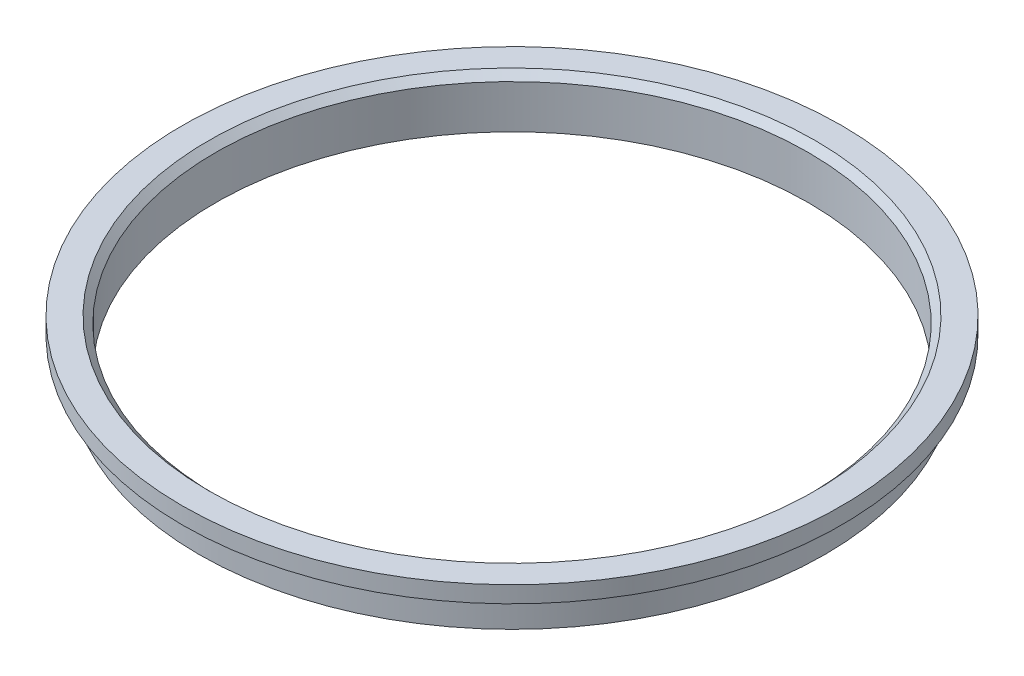
ISO-10303-21;
HEADER;
FILE_DESCRIPTION(('STEP AP214'),'2;1');
FILE_NAME('part.step','',(''),(''),'','','');
FILE_SCHEMA(('AUTOMOTIVE_DESIGN { 1 0 10303 214 1 1 1 1 }'));
ENDSEC;
DATA;
#1=APPLICATION_CONTEXT('core data for automotive mechanical design processes');
#2=APPLICATION_PROTOCOL_DEFINITION('international standard','automotive_design',2000,#1);
#3=PRODUCT_CONTEXT('',#1,'mechanical');
#4=PRODUCT('Part','Part','',(#3));
#5=PRODUCT_RELATED_PRODUCT_CATEGORY('part','',(#4));
#6=PRODUCT_DEFINITION_FORMATION('','',#4);
#7=PRODUCT_DEFINITION_CONTEXT('part definition',#1,'design');
#8=PRODUCT_DEFINITION('design','',#6,#7);
#9=PRODUCT_DEFINITION_SHAPE('','',#8);
#10=(LENGTH_UNIT() NAMED_UNIT(*) SI_UNIT(.MILLI.,.METRE.));
#11=(NAMED_UNIT(*) PLANE_ANGLE_UNIT() SI_UNIT($,.RADIAN.));
#12=(NAMED_UNIT(*) SI_UNIT($,.STERADIAN.) SOLID_ANGLE_UNIT());
#13=UNCERTAINTY_MEASURE_WITH_UNIT(LENGTH_MEASURE(1.E-05),#10,'distance_accuracy_value','');
#14=(GEOMETRIC_REPRESENTATION_CONTEXT(3) GLOBAL_UNCERTAINTY_ASSIGNED_CONTEXT((#13)) GLOBAL_UNIT_ASSIGNED_CONTEXT((#10,
#11,#12)) REPRESENTATION_CONTEXT('',''));
#15=CARTESIAN_POINT('',(0.,0.,0.));
#16=DIRECTION('',(0.,0.,1.));
#17=DIRECTION('',(1.,0.,0.));
#18=AXIS2_PLACEMENT_3D('',#15,#16,#17);
#19=CARTESIAN_POINT('',(-54.5465,-9.271,0.));
#20=DIRECTION('',(0.,1.,0.));
#21=DIRECTION('',(0.,0.,1.));
#22=AXIS2_PLACEMENT_3D('',#19,#20,#21);
#23=PLANE('',#22);
#24=CARTESIAN_POINT('',(0.,-9.271,0.));
#25=DIRECTION('',(0.,-1.,0.));
#26=DIRECTION('',(0.,0.,-1.));
#27=AXIS2_PLACEMENT_3D('',#24,#25,#26);
#28=CIRCLE('',#27,54.5465);
#29=CARTESIAN_POINT('',(0.,-9.271,-54.5465));
#30=VERTEX_POINT('',#29);
#31=EDGE_CURVE('E70',#30,#30,#28,.T.);
#32=ORIENTED_EDGE('',*,*,#31,.F.);
#33=EDGE_LOOP('',(#32));
#34=FACE_BOUND('',#33,.T.);
#35=CARTESIAN_POINT('',(0.,-9.271,0.));
#36=DIRECTION('',(0.,-1.,0.));
#37=DIRECTION('',(0.,0.,-1.));
#38=AXIS2_PLACEMENT_3D('',#35,#36,#37);
#39=CIRCLE('',#38,57.5945);
#40=CARTESIAN_POINT('',(0.,-9.271,-57.5945));
#41=VERTEX_POINT('',#40);
#42=EDGE_CURVE('E60',#41,#41,#39,.T.);
#43=ORIENTED_EDGE('',*,*,#42,.T.);
#44=EDGE_LOOP('',(#43));
#45=FACE_BOUND('',#44,.T.);
#46=ADVANCED_FACE('F34',(#34,#45),#23,.F.);
#47=CARTESIAN_POINT('',(0.,0.,0.));
#48=DIRECTION('',(0.,-1.,0.));
#49=DIRECTION('',(0.,0.,-1.));
#50=AXIS2_PLACEMENT_3D('',#47,#48,#49);
#51=CYLINDRICAL_SURFACE('',#50,57.5945);
#52=CARTESIAN_POINT('',(0.,-4.63550000000001,0.));
#53=DIRECTION('',(0.,1.,0.));
#54=DIRECTION('',(0.,0.,1.));
#55=AXIS2_PLACEMENT_3D('',#52,#53,#54);
#56=CIRCLE('',#55,57.5945);
#57=CARTESIAN_POINT('',(0.,-4.63550000000001,57.5945));
#58=VERTEX_POINT('',#57);
#59=EDGE_CURVE('E42',#58,#58,#56,.F.);
#60=ORIENTED_EDGE('',*,*,#59,.T.);
#61=EDGE_LOOP('',(#60));
#62=FACE_BOUND('',#61,.T.);
#63=ORIENTED_EDGE('',*,*,#42,.F.);
#64=EDGE_LOOP('',(#63));
#65=FACE_BOUND('',#64,.T.);
#66=ADVANCED_FACE('F78',(#62,#65),#51,.T.);
#67=CARTESIAN_POINT('',(-57.5945,-3.04800000000001,0.));
#68=DIRECTION('',(0.,1.,0.));
#69=DIRECTION('',(0.,0.,1.));
#70=AXIS2_PLACEMENT_3D('',#67,#68,#69);
#71=PLANE('',#70);
#72=CARTESIAN_POINT('',(0.,-3.04800000000001,0.));
#73=DIRECTION('',(0.,1.,0.));
#74=DIRECTION('',(0.,0.,1.));
#75=AXIS2_PLACEMENT_3D('',#72,#73,#74);
#76=CIRCLE('',#75,59.182);
#77=CARTESIAN_POINT('',(0.,-3.04800000000001,59.182));
#78=VERTEX_POINT('',#77);
#79=EDGE_CURVE('E10',#78,#78,#76,.T.);
#80=ORIENTED_EDGE('',*,*,#79,.T.);
#81=EDGE_LOOP('',(#80));
#82=FACE_BOUND('',#81,.T.);
#83=CARTESIAN_POINT('',(0.,-3.04800000000001,0.));
#84=DIRECTION('',(0.,-1.,0.));
#85=DIRECTION('',(0.,0.,-1.));
#86=AXIS2_PLACEMENT_3D('',#83,#84,#85);
#87=CIRCLE('',#86,60.6425);
#88=CARTESIAN_POINT('',(0.,-3.04800000000001,-60.6425));
#89=VERTEX_POINT('',#88);
#90=EDGE_CURVE('E64',#89,#89,#87,.T.);
#91=ORIENTED_EDGE('',*,*,#90,.T.);
#92=EDGE_LOOP('',(#91));
#93=FACE_BOUND('',#92,.T.);
#94=ADVANCED_FACE('F83',(#82,#93),#71,.F.);
#95=CARTESIAN_POINT('',(0.,0.,0.));
#96=DIRECTION('',(0.,-1.,0.));
#97=DIRECTION('',(0.,0.,-1.));
#98=AXIS2_PLACEMENT_3D('',#95,#96,#97);
#99=CYLINDRICAL_SURFACE('',#98,60.6425);
#100=ORIENTED_EDGE('',*,*,#90,.F.);
#101=EDGE_LOOP('',(#100));
#102=FACE_BOUND('',#101,.T.);
#103=CARTESIAN_POINT('',(0.,0.,0.));
#104=DIRECTION('',(0.,-1.,0.));
#105=DIRECTION('',(0.,0.,-1.));
#106=AXIS2_PLACEMENT_3D('',#103,#104,#105);
#107=CIRCLE('',#106,60.6425);
#108=CARTESIAN_POINT('',(0.,0.,-60.6425));
#109=VERTEX_POINT('',#108);
#110=EDGE_CURVE('E67',#109,#109,#107,.T.);
#111=ORIENTED_EDGE('',*,*,#110,.T.);
#112=EDGE_LOOP('',(#111));
#113=FACE_BOUND('',#112,.T.);
#114=ADVANCED_FACE('F88',(#102,#113),#99,.T.);
#115=CARTESIAN_POINT('',(-60.6425,0.,0.));
#116=DIRECTION('',(0.,-1.,0.));
#117=DIRECTION('',(0.,0.,-1.));
#118=AXIS2_PLACEMENT_3D('',#115,#116,#117);
#119=PLANE('',#118);
#120=CARTESIAN_POINT('',(0.,0.,0.));
#121=DIRECTION('',(0.,-1.,0.));
#122=DIRECTION('',(0.,0.,-1.));
#123=AXIS2_PLACEMENT_3D('',#120,#121,#122);
#124=CIRCLE('',#123,55.8165);
#125=CARTESIAN_POINT('',(0.,0.,-55.8165));
#126=VERTEX_POINT('',#125);
#127=EDGE_CURVE('E55',#126,#126,#124,.T.);
#128=ORIENTED_EDGE('',*,*,#127,.T.);
#129=EDGE_LOOP('',(#128));
#130=FACE_BOUND('',#129,.T.);
#131=ORIENTED_EDGE('',*,*,#110,.F.);
#132=EDGE_LOOP('',(#131));
#133=FACE_BOUND('',#132,.T.);
#134=ADVANCED_FACE('F99',(#130,#133),#119,.F.);
#135=CARTESIAN_POINT('',(0.,0.,0.));
#136=DIRECTION('',(0.,-1.,0.));
#137=DIRECTION('',(0.,0.,-1.));
#138=AXIS2_PLACEMENT_3D('',#135,#136,#137);
#139=CYLINDRICAL_SURFACE('',#138,54.5465);
#140=CARTESIAN_POINT('',(0.,-1.26999999999999,0.));
#141=DIRECTION('',(0.,-1.,0.));
#142=DIRECTION('',(0.,0.,-1.));
#143=AXIS2_PLACEMENT_3D('',#140,#141,#142);
#144=CIRCLE('',#143,54.5465);
#145=CARTESIAN_POINT('',(0.,-1.26999999999999,-54.5465));
#146=VERTEX_POINT('',#145);
#147=EDGE_CURVE('E49',#146,#146,#144,.F.);
#148=ORIENTED_EDGE('',*,*,#147,.T.);
#149=EDGE_LOOP('',(#148));
#150=FACE_BOUND('',#149,.T.);
#151=ORIENTED_EDGE('',*,*,#31,.T.);
#152=EDGE_LOOP('',(#151));
#153=FACE_BOUND('',#152,.T.);
#154=ADVANCED_FACE('F74',(#150,#153),#139,.F.);
#155=CARTESIAN_POINT('',(0.,0.,0.));
#156=DIRECTION('',(0.,1.,0.));
#157=DIRECTION('',(0.,0.,1.));
#158=AXIS2_PLACEMENT_3D('',#155,#156,#157);
#159=CONICAL_SURFACE('',#158,55.8165,0.785398163397448);
#160=ORIENTED_EDGE('',*,*,#147,.F.);
#161=EDGE_LOOP('',(#160));
#162=FACE_BOUND('',#161,.T.);
#163=ORIENTED_EDGE('',*,*,#127,.F.);
#164=EDGE_LOOP('',(#163));
#165=FACE_BOUND('',#164,.T.);
#166=ADVANCED_FACE('F91',(#162,#165),#159,.F.);
#167=CARTESIAN_POINT('',(0.,-4.63550000000001,0.));
#168=DIRECTION('',(0.,1.,0.));
#169=DIRECTION('',(0.,0.,1.));
#170=AXIS2_PLACEMENT_3D('',#167,#168,#169);
#171=TOROIDAL_SURFACE('',#170,59.182,1.5875);
#172=ORIENTED_EDGE('',*,*,#79,.F.);
#173=EDGE_LOOP('',(#172));
#174=FACE_BOUND('',#173,.T.);
#175=ORIENTED_EDGE('',*,*,#59,.F.);
#176=EDGE_LOOP('',(#175));
#177=FACE_BOUND('',#176,.T.);
#178=ADVANCED_FACE('F36',(#174,#177),#171,.F.);
#179=CLOSED_SHELL('',(#46,#66,#94,#114,#134,#154,#166,#178));
#180=MANIFOLD_SOLID_BREP('B2',#179);
#181=ADVANCED_BREP_SHAPE_REPRESENTATION('',(#18,#180),#14);
#182=SHAPE_DEFINITION_REPRESENTATION(#9,#181);
ENDSEC;
END-ISO-10303-21;
